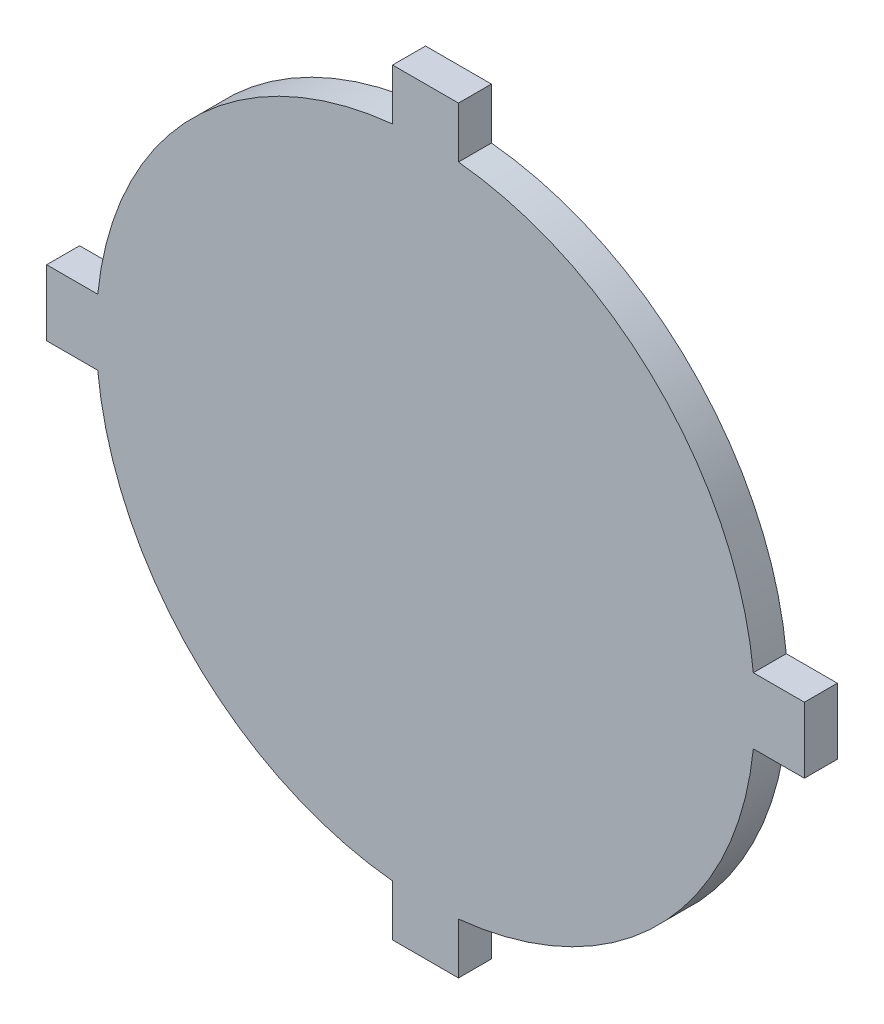
ISO-10303-21;
HEADER;
FILE_DESCRIPTION(('STEP AP214'),'2;1');
FILE_NAME('part.step','',(''),(''),'','','');
FILE_SCHEMA(('AUTOMOTIVE_DESIGN { 1 0 10303 214 1 1 1 1 }'));
ENDSEC;
DATA;
#1=APPLICATION_CONTEXT('core data for automotive mechanical design processes');
#2=APPLICATION_PROTOCOL_DEFINITION('international standard','automotive_design',2000,#1);
#3=PRODUCT_CONTEXT('',#1,'mechanical');
#4=PRODUCT('Part','Part','',(#3));
#5=PRODUCT_RELATED_PRODUCT_CATEGORY('part','',(#4));
#6=PRODUCT_DEFINITION_FORMATION('','',#4);
#7=PRODUCT_DEFINITION_CONTEXT('part definition',#1,'design');
#8=PRODUCT_DEFINITION('design','',#6,#7);
#9=PRODUCT_DEFINITION_SHAPE('','',#8);
#10=(LENGTH_UNIT() NAMED_UNIT(*) SI_UNIT(.MILLI.,.METRE.));
#11=(NAMED_UNIT(*) PLANE_ANGLE_UNIT() SI_UNIT($,.RADIAN.));
#12=(NAMED_UNIT(*) SI_UNIT($,.STERADIAN.) SOLID_ANGLE_UNIT());
#13=UNCERTAINTY_MEASURE_WITH_UNIT(LENGTH_MEASURE(1.E-05),#10,'distance_accuracy_value','');
#14=(GEOMETRIC_REPRESENTATION_CONTEXT(3) GLOBAL_UNCERTAINTY_ASSIGNED_CONTEXT((#13)) GLOBAL_UNIT_ASSIGNED_CONTEXT((#10,
#11,#12)) REPRESENTATION_CONTEXT('',''));
#15=CARTESIAN_POINT('',(0.,0.,0.));
#16=DIRECTION('',(0.,0.,1.));
#17=DIRECTION('',(1.,0.,0.));
#18=AXIS2_PLACEMENT_3D('',#15,#16,#17);
#19=CARTESIAN_POINT('',(0.,0.,2.));
#20=DIRECTION('',(0.,0.,-1.));
#21=DIRECTION('',(-1.,0.,0.));
#22=AXIS2_PLACEMENT_3D('',#19,#20,#21);
#23=CYLINDRICAL_SURFACE('',#22,20.);
#24=DIRECTION('',(0.,0.,-1.));
#25=VECTOR('',#24,1.);
#26=CARTESIAN_POINT('',(19.8997487421324,-2.,2.));
#27=LINE('',#26,#25);
#28=CARTESIAN_POINT('',(19.8997487421324,-2.,2.));
#29=VERTEX_POINT('',#28);
#30=CARTESIAN_POINT('',(19.8997487421324,-2.,0.));
#31=VERTEX_POINT('',#30);
#32=EDGE_CURVE('E60',#29,#31,#27,.T.);
#33=ORIENTED_EDGE('',*,*,#32,.F.);
#34=CARTESIAN_POINT('',(0.,0.,2.));
#35=DIRECTION('',(0.,0.,1.));
#36=DIRECTION('',(1.,0.,0.));
#37=AXIS2_PLACEMENT_3D('',#34,#35,#36);
#38=CIRCLE('',#37,20.);
#39=CARTESIAN_POINT('',(2.,-19.8997487421324,2.));
#40=VERTEX_POINT('',#39);
#41=EDGE_CURVE('E49',#40,#29,#38,.T.);
#42=ORIENTED_EDGE('',*,*,#41,.F.);
#43=DIRECTION('',(0.,0.,-1.));
#44=VECTOR('',#43,1.);
#45=CARTESIAN_POINT('',(2.,-19.8997487421324,2.));
#46=LINE('',#45,#44);
#47=CARTESIAN_POINT('',(2.,-19.8997487421324,0.));
#48=VERTEX_POINT('',#47);
#49=EDGE_CURVE('E174',#48,#40,#46,.F.);
#50=ORIENTED_EDGE('',*,*,#49,.F.);
#51=CARTESIAN_POINT('',(0.,0.,0.));
#52=DIRECTION('',(0.,0.,1.));
#53=DIRECTION('',(1.,0.,0.));
#54=AXIS2_PLACEMENT_3D('',#51,#52,#53);
#55=CIRCLE('',#54,20.);
#56=EDGE_CURVE('E270',#48,#31,#55,.T.);
#57=ORIENTED_EDGE('',*,*,#56,.T.);
#58=EDGE_LOOP('',(#33,#42,#50,#57));
#59=FACE_BOUND('',#58,.T.);
#60=ADVANCED_FACE('F41',(#59),#23,.T.);
#61=DIRECTION('',(0.,0.,-1.));
#62=VECTOR('',#61,1.);
#63=CARTESIAN_POINT('',(19.8997487421324,2.,2.));
#64=LINE('',#63,#62);
#65=CARTESIAN_POINT('',(19.8997487421324,2.,0.));
#66=VERTEX_POINT('',#65);
#67=CARTESIAN_POINT('',(19.8997487421324,2.,2.));
#68=VERTEX_POINT('',#67);
#69=EDGE_CURVE('E262',#66,#68,#64,.F.);
#70=ORIENTED_EDGE('',*,*,#69,.F.);
#71=CARTESIAN_POINT('',(2.,19.8997487421324,0.));
#72=VERTEX_POINT('',#71);
#73=EDGE_CURVE('E42',#66,#72,#55,.T.);
#74=ORIENTED_EDGE('',*,*,#73,.T.);
#75=DIRECTION('',(0.,0.,-1.));
#76=VECTOR('',#75,1.);
#77=CARTESIAN_POINT('',(2.,19.8997487421324,2.));
#78=LINE('',#77,#76);
#79=CARTESIAN_POINT('',(2.,19.8997487421324,2.));
#80=VERTEX_POINT('',#79);
#81=EDGE_CURVE('E256',#80,#72,#78,.T.);
#82=ORIENTED_EDGE('',*,*,#81,.F.);
#83=EDGE_CURVE('E11',#68,#80,#38,.T.);
#84=ORIENTED_EDGE('',*,*,#83,.F.);
#85=EDGE_LOOP('',(#70,#74,#82,#84));
#86=FACE_BOUND('',#85,.T.);
#87=ADVANCED_FACE('F335',(#86),#23,.T.);
#88=DIRECTION('',(0.,0.,-1.));
#89=VECTOR('',#88,1.);
#90=CARTESIAN_POINT('',(-2.,19.8997487421324,2.));
#91=LINE('',#90,#89);
#92=CARTESIAN_POINT('',(-2.,19.8997487421324,0.));
#93=VERTEX_POINT('',#92);
#94=CARTESIAN_POINT('',(-2.,19.8997487421324,2.));
#95=VERTEX_POINT('',#94);
#96=EDGE_CURVE('E261',#93,#95,#91,.F.);
#97=ORIENTED_EDGE('',*,*,#96,.F.);
#98=CARTESIAN_POINT('',(-19.8997487421324,2.,0.));
#99=VERTEX_POINT('',#98);
#100=EDGE_CURVE('E269',#93,#99,#55,.T.);
#101=ORIENTED_EDGE('',*,*,#100,.T.);
#102=DIRECTION('',(0.,0.,-1.));
#103=VECTOR('',#102,1.);
#104=CARTESIAN_POINT('',(-19.8997487421324,2.,2.));
#105=LINE('',#104,#103);
#106=CARTESIAN_POINT('',(-19.8997487421324,2.,2.));
#107=VERTEX_POINT('',#106);
#108=EDGE_CURVE('E252',#107,#99,#105,.T.);
#109=ORIENTED_EDGE('',*,*,#108,.F.);
#110=EDGE_CURVE('E47',#95,#107,#38,.T.);
#111=ORIENTED_EDGE('',*,*,#110,.F.);
#112=EDGE_LOOP('',(#97,#101,#109,#111));
#113=FACE_BOUND('',#112,.T.);
#114=ADVANCED_FACE('F277',(#113),#23,.T.);
#115=DIRECTION('',(0.,0.,-1.));
#116=VECTOR('',#115,1.);
#117=CARTESIAN_POINT('',(-19.8997487421324,-2.,2.));
#118=LINE('',#117,#116);
#119=CARTESIAN_POINT('',(-19.8997487421324,-2.,0.));
#120=VERTEX_POINT('',#119);
#121=CARTESIAN_POINT('',(-19.8997487421324,-2.,2.));
#122=VERTEX_POINT('',#121);
#123=EDGE_CURVE('E254',#120,#122,#118,.F.);
#124=ORIENTED_EDGE('',*,*,#123,.F.);
#125=CARTESIAN_POINT('',(-2.,-19.8997487421324,0.));
#126=VERTEX_POINT('',#125);
#127=EDGE_CURVE('E268',#120,#126,#55,.T.);
#128=ORIENTED_EDGE('',*,*,#127,.T.);
#129=DIRECTION('',(0.,0.,-1.));
#130=VECTOR('',#129,1.);
#131=CARTESIAN_POINT('',(-2.,-19.8997487421324,2.));
#132=LINE('',#131,#130);
#133=CARTESIAN_POINT('',(-2.,-19.8997487421324,2.));
#134=VERTEX_POINT('',#133);
#135=EDGE_CURVE('E61',#134,#126,#132,.T.);
#136=ORIENTED_EDGE('',*,*,#135,.F.);
#137=EDGE_CURVE('E272',#122,#134,#38,.T.);
#138=ORIENTED_EDGE('',*,*,#137,.F.);
#139=EDGE_LOOP('',(#124,#128,#136,#138));
#140=FACE_BOUND('',#139,.T.);
#141=ADVANCED_FACE('F334',(#140),#23,.T.);
#142=CARTESIAN_POINT('',(0.,0.,2.));
#143=DIRECTION('',(0.,0.,1.));
#144=DIRECTION('',(1.,0.,0.));
#145=AXIS2_PLACEMENT_3D('',#142,#143,#144);
#146=PLANE('',#145);
#147=ORIENTED_EDGE('',*,*,#41,.T.);
#148=DIRECTION('',(1.,0.,0.));
#149=VECTOR('',#148,1.);
#150=CARTESIAN_POINT('',(19.,-2.,2.));
#151=LINE('',#150,#149);
#152=CARTESIAN_POINT('',(23.,-2.,2.));
#153=VERTEX_POINT('',#152);
#154=EDGE_CURVE('E152',#29,#153,#151,.T.);
#155=ORIENTED_EDGE('',*,*,#154,.T.);
#156=DIRECTION('',(0.,1.,0.));
#157=VECTOR('',#156,1.);
#158=CARTESIAN_POINT('',(23.,-2.,2.));
#159=LINE('',#158,#157);
#160=CARTESIAN_POINT('',(23.,2.,2.));
#161=VERTEX_POINT('',#160);
#162=EDGE_CURVE('E157',#153,#161,#159,.T.);
#163=ORIENTED_EDGE('',*,*,#162,.T.);
#164=DIRECTION('',(-1.,0.,0.));
#165=VECTOR('',#164,1.);
#166=CARTESIAN_POINT('',(19.,2.,2.));
#167=LINE('',#166,#165);
#168=EDGE_CURVE('E179',#161,#68,#167,.T.);
#169=ORIENTED_EDGE('',*,*,#168,.T.);
#170=ORIENTED_EDGE('',*,*,#83,.T.);
#171=DIRECTION('',(0.,1.,0.));
#172=VECTOR('',#171,1.);
#173=CARTESIAN_POINT('',(2.,19.,2.));
#174=LINE('',#173,#172);
#175=CARTESIAN_POINT('',(2.,23.,2.));
#176=VERTEX_POINT('',#175);
#177=EDGE_CURVE('E202',#80,#176,#174,.T.);
#178=ORIENTED_EDGE('',*,*,#177,.T.);
#179=DIRECTION('',(-1.,0.,0.));
#180=VECTOR('',#179,1.);
#181=CARTESIAN_POINT('',(-2.,23.,2.));
#182=LINE('',#181,#180);
#183=CARTESIAN_POINT('',(-2.,23.,2.));
#184=VERTEX_POINT('',#183);
#185=EDGE_CURVE('E198',#176,#184,#182,.T.);
#186=ORIENTED_EDGE('',*,*,#185,.T.);
#187=DIRECTION('',(0.,-1.,0.));
#188=VECTOR('',#187,1.);
#189=CARTESIAN_POINT('',(-2.,19.,2.));
#190=LINE('',#189,#188);
#191=EDGE_CURVE('E199',#184,#95,#190,.T.);
#192=ORIENTED_EDGE('',*,*,#191,.T.);
#193=ORIENTED_EDGE('',*,*,#110,.T.);
#194=DIRECTION('',(-1.,0.,0.));
#195=VECTOR('',#194,1.);
#196=CARTESIAN_POINT('',(-23.,2.,2.));
#197=LINE('',#196,#195);
#198=CARTESIAN_POINT('',(-23.,2.,2.));
#199=VERTEX_POINT('',#198);
#200=EDGE_CURVE('E216',#107,#199,#197,.T.);
#201=ORIENTED_EDGE('',*,*,#200,.T.);
#202=DIRECTION('',(0.,-1.,0.));
#203=VECTOR('',#202,1.);
#204=CARTESIAN_POINT('',(-23.,-2.,2.));
#205=LINE('',#204,#203);
#206=CARTESIAN_POINT('',(-23.,-2.,2.));
#207=VERTEX_POINT('',#206);
#208=EDGE_CURVE('E219',#199,#207,#205,.T.);
#209=ORIENTED_EDGE('',*,*,#208,.T.);
#210=DIRECTION('',(1.,0.,0.));
#211=VECTOR('',#210,1.);
#212=CARTESIAN_POINT('',(-23.,-2.,2.));
#213=LINE('',#212,#211);
#214=EDGE_CURVE('E228',#207,#122,#213,.T.);
#215=ORIENTED_EDGE('',*,*,#214,.T.);
#216=ORIENTED_EDGE('',*,*,#137,.T.);
#217=DIRECTION('',(0.,-1.,0.));
#218=VECTOR('',#217,1.);
#219=CARTESIAN_POINT('',(-2.,-23.,2.));
#220=LINE('',#219,#218);
#221=CARTESIAN_POINT('',(-2.,-23.,2.));
#222=VERTEX_POINT('',#221);
#223=EDGE_CURVE('E244',#134,#222,#220,.T.);
#224=ORIENTED_EDGE('',*,*,#223,.T.);
#225=DIRECTION('',(1.,0.,0.));
#226=VECTOR('',#225,1.);
#227=CARTESIAN_POINT('',(-2.,-23.,2.));
#228=LINE('',#227,#226);
#229=CARTESIAN_POINT('',(2.,-23.,2.));
#230=VERTEX_POINT('',#229);
#231=EDGE_CURVE('E247',#222,#230,#228,.T.);
#232=ORIENTED_EDGE('',*,*,#231,.T.);
#233=DIRECTION('',(0.,1.,0.));
#234=VECTOR('',#233,1.);
#235=CARTESIAN_POINT('',(2.,-23.,2.));
#236=LINE('',#235,#234);
#237=EDGE_CURVE('E240',#230,#40,#236,.T.);
#238=ORIENTED_EDGE('',*,*,#237,.T.);
#239=EDGE_LOOP('',(#147,#155,#163,#169,#170,#178,#186,#192,#193,#201,#209,#215,#216,#224,#232,#238));
#240=FACE_BOUND('',#239,.T.);
#241=ADVANCED_FACE('F156',(#240),#146,.T.);
#242=CARTESIAN_POINT('',(0.,0.,0.));
#243=DIRECTION('',(0.,0.,1.));
#244=DIRECTION('',(1.,0.,0.));
#245=AXIS2_PLACEMENT_3D('',#242,#243,#244);
#246=PLANE('',#245);
#247=ORIENTED_EDGE('',*,*,#73,.F.);
#248=DIRECTION('',(-1.,0.,0.));
#249=VECTOR('',#248,1.);
#250=CARTESIAN_POINT('',(19.,2.,0.));
#251=LINE('',#250,#249);
#252=CARTESIAN_POINT('',(23.,2.,0.));
#253=VERTEX_POINT('',#252);
#254=EDGE_CURVE('E162',#253,#66,#251,.T.);
#255=ORIENTED_EDGE('',*,*,#254,.F.);
#256=DIRECTION('',(0.,1.,0.));
#257=VECTOR('',#256,1.);
#258=CARTESIAN_POINT('',(23.,-2.,0.));
#259=LINE('',#258,#257);
#260=CARTESIAN_POINT('',(23.,-2.,0.));
#261=VERTEX_POINT('',#260);
#262=EDGE_CURVE('E181',#261,#253,#259,.T.);
#263=ORIENTED_EDGE('',*,*,#262,.F.);
#264=DIRECTION('',(1.,0.,0.));
#265=VECTOR('',#264,1.);
#266=CARTESIAN_POINT('',(19.,-2.,0.));
#267=LINE('',#266,#265);
#268=EDGE_CURVE('E166',#31,#261,#267,.T.);
#269=ORIENTED_EDGE('',*,*,#268,.F.);
#270=ORIENTED_EDGE('',*,*,#56,.F.);
#271=DIRECTION('',(0.,1.,0.));
#272=VECTOR('',#271,1.);
#273=CARTESIAN_POINT('',(2.,-23.,0.));
#274=LINE('',#273,#272);
#275=CARTESIAN_POINT('',(2.,-23.,0.));
#276=VERTEX_POINT('',#275);
#277=EDGE_CURVE('E236',#276,#48,#274,.T.);
#278=ORIENTED_EDGE('',*,*,#277,.F.);
#279=DIRECTION('',(1.,0.,0.));
#280=VECTOR('',#279,1.);
#281=CARTESIAN_POINT('',(-2.,-23.,0.));
#282=LINE('',#281,#280);
#283=CARTESIAN_POINT('',(-2.,-23.,0.));
#284=VERTEX_POINT('',#283);
#285=EDGE_CURVE('E243',#284,#276,#282,.T.);
#286=ORIENTED_EDGE('',*,*,#285,.F.);
#287=DIRECTION('',(0.,-1.,0.));
#288=VECTOR('',#287,1.);
#289=CARTESIAN_POINT('',(-2.,-23.,0.));
#290=LINE('',#289,#288);
#291=EDGE_CURVE('E213',#126,#284,#290,.T.);
#292=ORIENTED_EDGE('',*,*,#291,.F.);
#293=ORIENTED_EDGE('',*,*,#127,.F.);
#294=DIRECTION('',(1.,0.,0.));
#295=VECTOR('',#294,1.);
#296=CARTESIAN_POINT('',(-23.,-2.,0.));
#297=LINE('',#296,#295);
#298=CARTESIAN_POINT('',(-23.,-2.,0.));
#299=VERTEX_POINT('',#298);
#300=EDGE_CURVE('E218',#299,#120,#297,.T.);
#301=ORIENTED_EDGE('',*,*,#300,.F.);
#302=DIRECTION('',(0.,-1.,0.));
#303=VECTOR('',#302,1.);
#304=CARTESIAN_POINT('',(-23.,-2.,0.));
#305=LINE('',#304,#303);
#306=CARTESIAN_POINT('',(-23.,2.,0.));
#307=VERTEX_POINT('',#306);
#308=EDGE_CURVE('E194',#307,#299,#305,.T.);
#309=ORIENTED_EDGE('',*,*,#308,.F.);
#310=DIRECTION('',(-1.,0.,0.));
#311=VECTOR('',#310,1.);
#312=CARTESIAN_POINT('',(-23.,2.,0.));
#313=LINE('',#312,#311);
#314=EDGE_CURVE('E220',#99,#307,#313,.T.);
#315=ORIENTED_EDGE('',*,*,#314,.F.);
#316=ORIENTED_EDGE('',*,*,#100,.F.);
#317=DIRECTION('',(0.,-1.,0.));
#318=VECTOR('',#317,1.);
#319=CARTESIAN_POINT('',(-2.,19.,0.));
#320=LINE('',#319,#318);
#321=CARTESIAN_POINT('',(-2.,23.,0.));
#322=VERTEX_POINT('',#321);
#323=EDGE_CURVE('E184',#322,#93,#320,.T.);
#324=ORIENTED_EDGE('',*,*,#323,.F.);
#325=DIRECTION('',(-1.,0.,0.));
#326=VECTOR('',#325,1.);
#327=CARTESIAN_POINT('',(-2.,23.,0.));
#328=LINE('',#327,#326);
#329=CARTESIAN_POINT('',(2.,23.,0.));
#330=VERTEX_POINT('',#329);
#331=EDGE_CURVE('E197',#330,#322,#328,.T.);
#332=ORIENTED_EDGE('',*,*,#331,.F.);
#333=DIRECTION('',(0.,1.,0.));
#334=VECTOR('',#333,1.);
#335=CARTESIAN_POINT('',(2.,19.,0.));
#336=LINE('',#335,#334);
#337=EDGE_CURVE('E200',#72,#330,#336,.T.);
#338=ORIENTED_EDGE('',*,*,#337,.F.);
#339=EDGE_LOOP('',(#247,#255,#263,#269,#270,#278,#286,#292,#293,#301,#309,#315,#316,#324,#332,#338));
#340=FACE_BOUND('',#339,.T.);
#341=ADVANCED_FACE('F287',(#340),#246,.F.);
#342=CARTESIAN_POINT('',(-2.,-23.,2.));
#343=DIRECTION('',(1.,0.,0.));
#344=DIRECTION('',(0.,0.,-1.));
#345=AXIS2_PLACEMENT_3D('',#342,#343,#344);
#346=PLANE('',#345);
#347=ORIENTED_EDGE('',*,*,#223,.F.);
#348=ORIENTED_EDGE('',*,*,#135,.T.);
#349=ORIENTED_EDGE('',*,*,#291,.T.);
#350=DIRECTION('',(0.,0.,-1.));
#351=VECTOR('',#350,1.);
#352=CARTESIAN_POINT('',(-2.,-23.,2.));
#353=LINE('',#352,#351);
#354=EDGE_CURVE('E232',#222,#284,#353,.T.);
#355=ORIENTED_EDGE('',*,*,#354,.F.);
#356=EDGE_LOOP('',(#347,#348,#349,#355));
#357=FACE_BOUND('',#356,.T.);
#358=ADVANCED_FACE('F299',(#357),#346,.F.);
#359=CARTESIAN_POINT('',(2.,-23.,2.));
#360=DIRECTION('',(-1.,0.,0.));
#361=DIRECTION('',(0.,0.,1.));
#362=AXIS2_PLACEMENT_3D('',#359,#360,#361);
#363=PLANE('',#362);
#364=ORIENTED_EDGE('',*,*,#277,.T.);
#365=ORIENTED_EDGE('',*,*,#49,.T.);
#366=ORIENTED_EDGE('',*,*,#237,.F.);
#367=DIRECTION('',(0.,0.,-1.));
#368=VECTOR('',#367,1.);
#369=CARTESIAN_POINT('',(2.,-23.,2.));
#370=LINE('',#369,#368);
#371=EDGE_CURVE('E231',#230,#276,#370,.T.);
#372=ORIENTED_EDGE('',*,*,#371,.T.);
#373=EDGE_LOOP('',(#364,#365,#366,#372));
#374=FACE_BOUND('',#373,.T.);
#375=ADVANCED_FACE('F303',(#374),#363,.F.);
#376=CARTESIAN_POINT('',(-2.,-23.,2.));
#377=DIRECTION('',(0.,1.,0.));
#378=DIRECTION('',(0.,0.,1.));
#379=AXIS2_PLACEMENT_3D('',#376,#377,#378);
#380=PLANE('',#379);
#381=ORIENTED_EDGE('',*,*,#285,.T.);
#382=ORIENTED_EDGE('',*,*,#371,.F.);
#383=ORIENTED_EDGE('',*,*,#231,.F.);
#384=ORIENTED_EDGE('',*,*,#354,.T.);
#385=EDGE_LOOP('',(#381,#382,#383,#384));
#386=FACE_BOUND('',#385,.T.);
#387=ADVANCED_FACE('F302',(#386),#380,.F.);
#388=CARTESIAN_POINT('',(-23.,-2.,2.));
#389=DIRECTION('',(0.,1.,0.));
#390=DIRECTION('',(0.,0.,1.));
#391=AXIS2_PLACEMENT_3D('',#388,#389,#390);
#392=PLANE('',#391);
#393=ORIENTED_EDGE('',*,*,#300,.T.);
#394=ORIENTED_EDGE('',*,*,#123,.T.);
#395=ORIENTED_EDGE('',*,*,#214,.F.);
#396=DIRECTION('',(0.,0.,-1.));
#397=VECTOR('',#396,1.);
#398=CARTESIAN_POINT('',(-23.,-2.,2.));
#399=LINE('',#398,#397);
#400=EDGE_CURVE('E207',#207,#299,#399,.T.);
#401=ORIENTED_EDGE('',*,*,#400,.T.);
#402=EDGE_LOOP('',(#393,#394,#395,#401));
#403=FACE_BOUND('',#402,.T.);
#404=ADVANCED_FACE('F341',(#403),#392,.F.);
#405=CARTESIAN_POINT('',(-23.,2.,2.));
#406=DIRECTION('',(0.,-1.,0.));
#407=DIRECTION('',(0.,0.,-1.));
#408=AXIS2_PLACEMENT_3D('',#405,#406,#407);
#409=PLANE('',#408);
#410=ORIENTED_EDGE('',*,*,#200,.F.);
#411=ORIENTED_EDGE('',*,*,#108,.T.);
#412=ORIENTED_EDGE('',*,*,#314,.T.);
#413=DIRECTION('',(0.,0.,-1.));
#414=VECTOR('',#413,1.);
#415=CARTESIAN_POINT('',(-23.,2.,2.));
#416=LINE('',#415,#414);
#417=EDGE_CURVE('E215',#199,#307,#416,.T.);
#418=ORIENTED_EDGE('',*,*,#417,.F.);
#419=EDGE_LOOP('',(#410,#411,#412,#418));
#420=FACE_BOUND('',#419,.T.);
#421=ADVANCED_FACE('F282',(#420),#409,.F.);
#422=CARTESIAN_POINT('',(-23.,-2.,2.));
#423=DIRECTION('',(1.,0.,0.));
#424=DIRECTION('',(0.,0.,-1.));
#425=AXIS2_PLACEMENT_3D('',#422,#423,#424);
#426=PLANE('',#425);
#427=ORIENTED_EDGE('',*,*,#308,.T.);
#428=ORIENTED_EDGE('',*,*,#400,.F.);
#429=ORIENTED_EDGE('',*,*,#208,.F.);
#430=ORIENTED_EDGE('',*,*,#417,.T.);
#431=EDGE_LOOP('',(#427,#428,#429,#430));
#432=FACE_BOUND('',#431,.T.);
#433=ADVANCED_FACE('F288',(#432),#426,.F.);
#434=CARTESIAN_POINT('',(-2.,19.,2.));
#435=DIRECTION('',(1.,0.,0.));
#436=DIRECTION('',(0.,0.,-1.));
#437=AXIS2_PLACEMENT_3D('',#434,#435,#436);
#438=PLANE('',#437);
#439=ORIENTED_EDGE('',*,*,#323,.T.);
#440=ORIENTED_EDGE('',*,*,#96,.T.);
#441=ORIENTED_EDGE('',*,*,#191,.F.);
#442=DIRECTION('',(0.,0.,-1.));
#443=VECTOR('',#442,1.);
#444=CARTESIAN_POINT('',(-2.,23.,2.));
#445=LINE('',#444,#443);
#446=EDGE_CURVE('E195',#184,#322,#445,.T.);
#447=ORIENTED_EDGE('',*,*,#446,.T.);
#448=EDGE_LOOP('',(#439,#440,#441,#447));
#449=FACE_BOUND('',#448,.T.);
#450=ADVANCED_FACE('F321',(#449),#438,.F.);
#451=CARTESIAN_POINT('',(2.,19.,2.));
#452=DIRECTION('',(-1.,0.,0.));
#453=DIRECTION('',(0.,0.,1.));
#454=AXIS2_PLACEMENT_3D('',#451,#452,#453);
#455=PLANE('',#454);
#456=ORIENTED_EDGE('',*,*,#177,.F.);
#457=ORIENTED_EDGE('',*,*,#81,.T.);
#458=ORIENTED_EDGE('',*,*,#337,.T.);
#459=DIRECTION('',(0.,0.,-1.));
#460=VECTOR('',#459,1.);
#461=CARTESIAN_POINT('',(2.,23.,2.));
#462=LINE('',#461,#460);
#463=EDGE_CURVE('E190',#176,#330,#462,.T.);
#464=ORIENTED_EDGE('',*,*,#463,.F.);
#465=EDGE_LOOP('',(#456,#457,#458,#464));
#466=FACE_BOUND('',#465,.T.);
#467=ADVANCED_FACE('F311',(#466),#455,.F.);
#468=CARTESIAN_POINT('',(-2.,23.,2.));
#469=DIRECTION('',(0.,-1.,0.));
#470=DIRECTION('',(0.,0.,-1.));
#471=AXIS2_PLACEMENT_3D('',#468,#469,#470);
#472=PLANE('',#471);
#473=ORIENTED_EDGE('',*,*,#331,.T.);
#474=ORIENTED_EDGE('',*,*,#446,.F.);
#475=ORIENTED_EDGE('',*,*,#185,.F.);
#476=ORIENTED_EDGE('',*,*,#463,.T.);
#477=EDGE_LOOP('',(#473,#474,#475,#476));
#478=FACE_BOUND('',#477,.T.);
#479=ADVANCED_FACE('F317',(#478),#472,.F.);
#480=CARTESIAN_POINT('',(19.,-2.,2.));
#481=DIRECTION('',(0.,1.,0.));
#482=DIRECTION('',(0.,0.,1.));
#483=AXIS2_PLACEMENT_3D('',#480,#481,#482);
#484=PLANE('',#483);
#485=ORIENTED_EDGE('',*,*,#154,.F.);
#486=ORIENTED_EDGE('',*,*,#32,.T.);
#487=ORIENTED_EDGE('',*,*,#268,.T.);
#488=DIRECTION('',(0.,0.,-1.));
#489=VECTOR('',#488,1.);
#490=CARTESIAN_POINT('',(23.,-2.,2.));
#491=LINE('',#490,#489);
#492=EDGE_CURVE('E167',#153,#261,#491,.T.);
#493=ORIENTED_EDGE('',*,*,#492,.F.);
#494=EDGE_LOOP('',(#485,#486,#487,#493));
#495=FACE_BOUND('',#494,.T.);
#496=ADVANCED_FACE('F170',(#495),#484,.F.);
#497=CARTESIAN_POINT('',(19.,2.,2.));
#498=DIRECTION('',(0.,-1.,0.));
#499=DIRECTION('',(0.,0.,-1.));
#500=AXIS2_PLACEMENT_3D('',#497,#498,#499);
#501=PLANE('',#500);
#502=ORIENTED_EDGE('',*,*,#254,.T.);
#503=ORIENTED_EDGE('',*,*,#69,.T.);
#504=ORIENTED_EDGE('',*,*,#168,.F.);
#505=DIRECTION('',(0.,0.,-1.));
#506=VECTOR('',#505,1.);
#507=CARTESIAN_POINT('',(23.,2.,2.));
#508=LINE('',#507,#506);
#509=EDGE_CURVE('E172',#161,#253,#508,.T.);
#510=ORIENTED_EDGE('',*,*,#509,.T.);
#511=EDGE_LOOP('',(#502,#503,#504,#510));
#512=FACE_BOUND('',#511,.T.);
#513=ADVANCED_FACE('F310',(#512),#501,.F.);
#514=CARTESIAN_POINT('',(23.,-2.,2.));
#515=DIRECTION('',(-1.,0.,0.));
#516=DIRECTION('',(0.,0.,1.));
#517=AXIS2_PLACEMENT_3D('',#514,#515,#516);
#518=PLANE('',#517);
#519=ORIENTED_EDGE('',*,*,#262,.T.);
#520=ORIENTED_EDGE('',*,*,#509,.F.);
#521=ORIENTED_EDGE('',*,*,#162,.F.);
#522=ORIENTED_EDGE('',*,*,#492,.T.);
#523=EDGE_LOOP('',(#519,#520,#521,#522));
#524=FACE_BOUND('',#523,.T.);
#525=ADVANCED_FACE('F171',(#524),#518,.F.);
#526=CLOSED_SHELL('',(#60,#87,#114,#141,#241,#341,#358,#375,#387,#404,#421,#433,#450,#467,#479,
#496,#513,#525));
#527=MANIFOLD_SOLID_BREP('B2',#526);
#528=ADVANCED_BREP_SHAPE_REPRESENTATION('',(#18,#527),#14);
#529=SHAPE_DEFINITION_REPRESENTATION(#9,#528);
ENDSEC;
END-ISO-10303-21;
